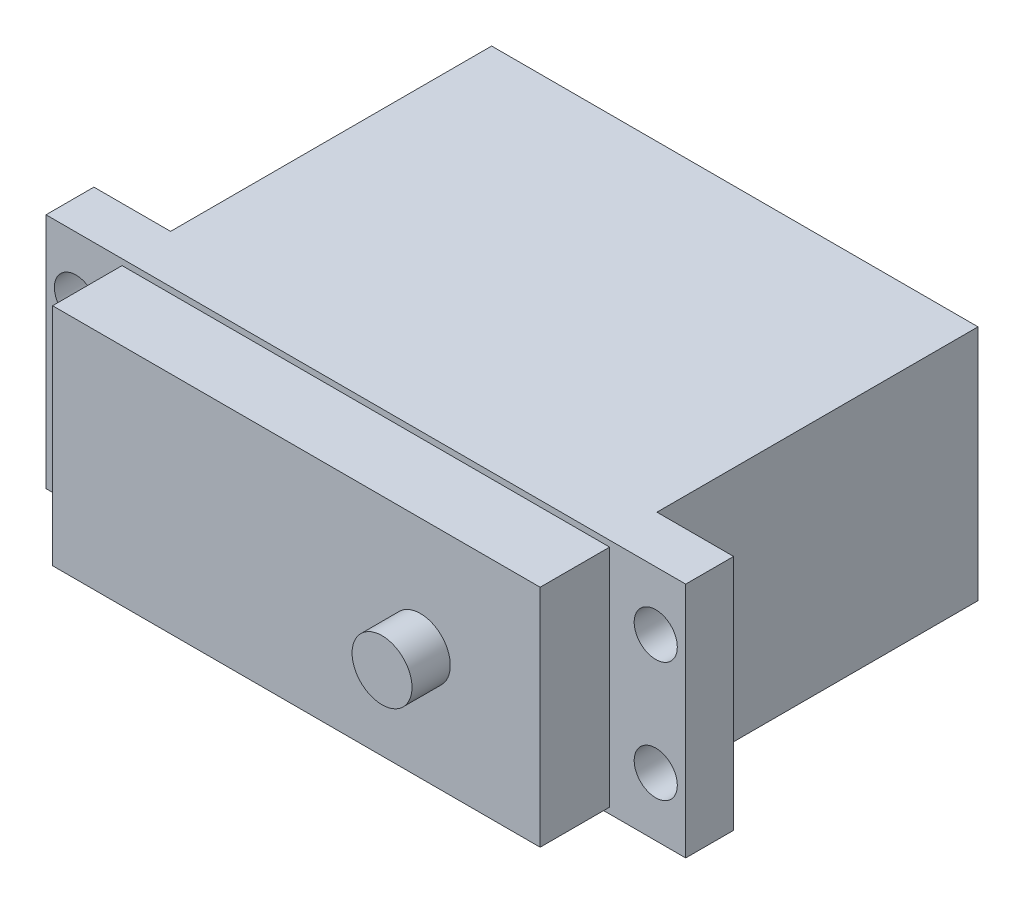
ISO-10303-21;
HEADER;
FILE_DESCRIPTION(('STEP AP214'),'2;1');
FILE_NAME('part.step','',(''),(''),'','','');
FILE_SCHEMA(('AUTOMOTIVE_DESIGN { 1 0 10303 214 1 1 1 1 }'));
ENDSEC;
DATA;
#1=APPLICATION_CONTEXT('core data for automotive mechanical design processes');
#2=APPLICATION_PROTOCOL_DEFINITION('international standard','automotive_design',2000,#1);
#3=PRODUCT_CONTEXT('',#1,'mechanical');
#4=PRODUCT('Part','Part','',(#3));
#5=PRODUCT_RELATED_PRODUCT_CATEGORY('part','',(#4));
#6=PRODUCT_DEFINITION_FORMATION('','',#4);
#7=PRODUCT_DEFINITION_CONTEXT('part definition',#1,'design');
#8=PRODUCT_DEFINITION('design','',#6,#7);
#9=PRODUCT_DEFINITION_SHAPE('','',#8);
#10=(LENGTH_UNIT() NAMED_UNIT(*) SI_UNIT(.MILLI.,.METRE.));
#11=(NAMED_UNIT(*) PLANE_ANGLE_UNIT() SI_UNIT($,.RADIAN.));
#12=(NAMED_UNIT(*) SI_UNIT($,.STERADIAN.) SOLID_ANGLE_UNIT());
#13=UNCERTAINTY_MEASURE_WITH_UNIT(LENGTH_MEASURE(1.E-05),#10,'distance_accuracy_value','');
#14=(GEOMETRIC_REPRESENTATION_CONTEXT(3) GLOBAL_UNCERTAINTY_ASSIGNED_CONTEXT((#13)) GLOBAL_UNIT_ASSIGNED_CONTEXT((#10,
#11,#12)) REPRESENTATION_CONTEXT('',''));
#15=CARTESIAN_POINT('',(0.,0.,0.));
#16=DIRECTION('',(0.,0.,1.));
#17=DIRECTION('',(1.,0.,0.));
#18=AXIS2_PLACEMENT_3D('',#15,#16,#17);
#19=CARTESIAN_POINT('',(0.,0.,30.8));
#20=DIRECTION('',(0.,0.,1.));
#21=DIRECTION('',(1.,0.,0.));
#22=AXIS2_PLACEMENT_3D('',#19,#20,#21);
#23=PLANE('',#22);
#24=CARTESIAN_POINT('',(-3.9,14.9,30.8));
#25=DIRECTION('',(0.,0.,1.));
#26=DIRECTION('',(1.,0.,0.));
#27=AXIS2_PLACEMENT_3D('',#24,#25,#26);
#28=CIRCLE('',#27,1.8);
#29=CARTESIAN_POINT('',(-2.1,14.9,30.8));
#30=VERTEX_POINT('',#29);
#31=EDGE_CURVE('E167',#30,#30,#28,.T.);
#32=ORIENTED_EDGE('',*,*,#31,.F.);
#33=EDGE_LOOP('',(#32));
#34=FACE_BOUND('',#33,.T.);
#35=CARTESIAN_POINT('',(-3.9,4.9,30.8));
#36=DIRECTION('',(0.,0.,1.));
#37=DIRECTION('',(1.,0.,0.));
#38=AXIS2_PLACEMENT_3D('',#35,#36,#37);
#39=CIRCLE('',#38,1.8);
#40=CARTESIAN_POINT('',(-2.1,4.9,30.8));
#41=VERTEX_POINT('',#40);
#42=EDGE_CURVE('E174',#41,#41,#39,.T.);
#43=ORIENTED_EDGE('',*,*,#42,.F.);
#44=EDGE_LOOP('',(#43));
#45=FACE_BOUND('',#44,.T.);
#46=CARTESIAN_POINT('',(44.5,4.9,30.8));
#47=DIRECTION('',(0.,0.,1.));
#48=DIRECTION('',(1.,0.,0.));
#49=AXIS2_PLACEMENT_3D('',#46,#47,#48);
#50=CIRCLE('',#49,1.8);
#51=CARTESIAN_POINT('',(46.3,4.9,30.8));
#52=VERTEX_POINT('',#51);
#53=EDGE_CURVE('E180',#52,#52,#50,.T.);
#54=ORIENTED_EDGE('',*,*,#53,.F.);
#55=EDGE_LOOP('',(#54));
#56=FACE_BOUND('',#55,.T.);
#57=CARTESIAN_POINT('',(44.5,14.9,30.8));
#58=DIRECTION('',(0.,0.,1.));
#59=DIRECTION('',(1.,0.,0.));
#60=AXIS2_PLACEMENT_3D('',#57,#58,#59);
#61=CIRCLE('',#60,1.8);
#62=CARTESIAN_POINT('',(46.3,14.9,30.8));
#63=VERTEX_POINT('',#62);
#64=EDGE_CURVE('E186',#63,#63,#61,.T.);
#65=ORIENTED_EDGE('',*,*,#64,.F.);
#66=EDGE_LOOP('',(#65));
#67=FACE_BOUND('',#66,.T.);
#68=DIRECTION('',(0.,-1.,0.));
#69=VECTOR('',#68,1.);
#70=CARTESIAN_POINT('',(-6.4,0.,30.8));
#71=LINE('',#70,#69);
#72=CARTESIAN_POINT('',(-6.4,19.8,30.8));
#73=VERTEX_POINT('',#72);
#74=CARTESIAN_POINT('',(-6.4,0.,30.8));
#75=VERTEX_POINT('',#74);
#76=EDGE_CURVE('E193',#73,#75,#71,.T.);
#77=ORIENTED_EDGE('',*,*,#76,.T.);
#78=DIRECTION('',(1.,0.,0.));
#79=VECTOR('',#78,1.);
#80=CARTESIAN_POINT('',(47.,0.,30.8));
#81=LINE('',#80,#79);
#82=CARTESIAN_POINT('',(47.,0.,30.8));
#83=VERTEX_POINT('',#82);
#84=EDGE_CURVE('E196',#75,#83,#81,.T.);
#85=ORIENTED_EDGE('',*,*,#84,.T.);
#86=DIRECTION('',(0.,1.,0.));
#87=VECTOR('',#86,1.);
#88=CARTESIAN_POINT('',(47.,0.,30.8));
#89=LINE('',#88,#87);
#90=CARTESIAN_POINT('',(47.,19.8,30.8));
#91=VERTEX_POINT('',#90);
#92=EDGE_CURVE('E199',#83,#91,#89,.T.);
#93=ORIENTED_EDGE('',*,*,#92,.T.);
#94=DIRECTION('',(-1.,0.,0.));
#95=VECTOR('',#94,1.);
#96=CARTESIAN_POINT('',(47.,19.8,30.8));
#97=LINE('',#96,#95);
#98=EDGE_CURVE('E201',#91,#73,#97,.T.);
#99=ORIENTED_EDGE('',*,*,#98,.T.);
#100=EDGE_LOOP('',(#77,#85,#93,#99));
#101=FACE_BOUND('',#100,.T.);
#102=DIRECTION('',(0.,1.,0.));
#103=VECTOR('',#102,1.);
#104=CARTESIAN_POINT('',(40.65,0.49999999999999,30.8));
#105=LINE('',#104,#103);
#106=CARTESIAN_POINT('',(40.65,0.49999999999999,30.8));
#107=VERTEX_POINT('',#106);
#108=CARTESIAN_POINT('',(40.65,19.3,30.8));
#109=VERTEX_POINT('',#108);
#110=EDGE_CURVE('E147',#107,#109,#105,.T.);
#111=ORIENTED_EDGE('',*,*,#110,.F.);
#112=DIRECTION('',(1.,0.,0.));
#113=VECTOR('',#112,1.);
#114=CARTESIAN_POINT('',(-0.0499999999999962,0.49999999999999,30.8));
#115=LINE('',#114,#113);
#116=CARTESIAN_POINT('',(-0.0499999999999962,0.49999999999999,30.8));
#117=VERTEX_POINT('',#116);
#118=EDGE_CURVE('E50',#117,#107,#115,.T.);
#119=ORIENTED_EDGE('',*,*,#118,.F.);
#120=DIRECTION('',(0.,-1.,0.));
#121=VECTOR('',#120,1.);
#122=CARTESIAN_POINT('',(-0.0499999999999962,0.49999999999999,30.8));
#123=LINE('',#122,#121);
#124=CARTESIAN_POINT('',(-0.0499999999999962,19.3,30.8));
#125=VERTEX_POINT('',#124);
#126=EDGE_CURVE('E154',#125,#117,#123,.T.);
#127=ORIENTED_EDGE('',*,*,#126,.F.);
#128=DIRECTION('',(-1.,0.,0.));
#129=VECTOR('',#128,1.);
#130=CARTESIAN_POINT('',(-0.0499999999999962,19.3,30.8));
#131=LINE('',#130,#129);
#132=EDGE_CURVE('E138',#109,#125,#131,.T.);
#133=ORIENTED_EDGE('',*,*,#132,.F.);
#134=EDGE_LOOP('',(#111,#119,#127,#133));
#135=FACE_BOUND('',#134,.T.);
#136=ADVANCED_FACE('F35',(#34,#45,#56,#67,#101,#135),#23,.T.);
#137=CARTESIAN_POINT('',(0.,0.,26.8));
#138=DIRECTION('',(1.,0.,0.));
#139=DIRECTION('',(0.,0.,-1.));
#140=AXIS2_PLACEMENT_3D('',#137,#138,#139);
#141=PLANE('',#140);
#142=DIRECTION('',(0.,-1.,0.));
#143=VECTOR('',#142,1.);
#144=CARTESIAN_POINT('',(0.,0.,0.));
#145=LINE('',#144,#143);
#146=CARTESIAN_POINT('',(0.,19.8,0.));
#147=VERTEX_POINT('',#146);
#148=CARTESIAN_POINT('',(0.,0.,0.));
#149=VERTEX_POINT('',#148);
#150=EDGE_CURVE('E226',#147,#149,#145,.T.);
#151=ORIENTED_EDGE('',*,*,#150,.T.);
#152=DIRECTION('',(0.,0.,-1.));
#153=VECTOR('',#152,1.);
#154=CARTESIAN_POINT('',(0.,0.,26.8));
#155=LINE('',#154,#153);
#156=CARTESIAN_POINT('',(0.,0.,26.8));
#157=VERTEX_POINT('',#156);
#158=EDGE_CURVE('E43',#157,#149,#155,.T.);
#159=ORIENTED_EDGE('',*,*,#158,.F.);
#160=DIRECTION('',(0.,-1.,0.));
#161=VECTOR('',#160,1.);
#162=CARTESIAN_POINT('',(0.,0.,26.8));
#163=LINE('',#162,#161);
#164=CARTESIAN_POINT('',(0.,19.8,26.8));
#165=VERTEX_POINT('',#164);
#166=EDGE_CURVE('E227',#165,#157,#163,.T.);
#167=ORIENTED_EDGE('',*,*,#166,.F.);
#168=DIRECTION('',(0.,0.,-1.));
#169=VECTOR('',#168,1.);
#170=CARTESIAN_POINT('',(0.,19.8,26.8));
#171=LINE('',#170,#169);
#172=EDGE_CURVE('E59',#165,#147,#171,.T.);
#173=ORIENTED_EDGE('',*,*,#172,.T.);
#174=EDGE_LOOP('',(#151,#159,#167,#173));
#175=FACE_BOUND('',#174,.T.);
#176=ADVANCED_FACE('F37',(#175),#141,.F.);
#177=CARTESIAN_POINT('',(0.,0.,26.8));
#178=DIRECTION('',(0.,1.,0.));
#179=DIRECTION('',(0.,0.,1.));
#180=AXIS2_PLACEMENT_3D('',#177,#178,#179);
#181=PLANE('',#180);
#182=DIRECTION('',(1.,0.,0.));
#183=VECTOR('',#182,1.);
#184=CARTESIAN_POINT('',(0.,0.,0.));
#185=LINE('',#184,#183);
#186=CARTESIAN_POINT('',(40.6,0.,0.));
#187=VERTEX_POINT('',#186);
#188=EDGE_CURVE('E233',#149,#187,#185,.T.);
#189=ORIENTED_EDGE('',*,*,#188,.T.);
#190=DIRECTION('',(0.,0.,-1.));
#191=VECTOR('',#190,1.);
#192=CARTESIAN_POINT('',(40.6,0.,26.8));
#193=LINE('',#192,#191);
#194=CARTESIAN_POINT('',(40.6,0.,26.8));
#195=VERTEX_POINT('',#194);
#196=EDGE_CURVE('E241',#195,#187,#193,.T.);
#197=ORIENTED_EDGE('',*,*,#196,.F.);
#198=DIRECTION('',(1.,0.,0.));
#199=VECTOR('',#198,1.);
#200=CARTESIAN_POINT('',(47.,0.,26.8));
#201=LINE('',#200,#199);
#202=CARTESIAN_POINT('',(47.,0.,26.8));
#203=VERTEX_POINT('',#202);
#204=EDGE_CURVE('E206',#195,#203,#201,.T.);
#205=ORIENTED_EDGE('',*,*,#204,.T.);
#206=DIRECTION('',(0.,0.,-1.));
#207=VECTOR('',#206,1.);
#208=CARTESIAN_POINT('',(47.,0.,30.8));
#209=LINE('',#208,#207);
#210=EDGE_CURVE('E220',#83,#203,#209,.T.);
#211=ORIENTED_EDGE('',*,*,#210,.F.);
#212=ORIENTED_EDGE('',*,*,#84,.F.);
#213=DIRECTION('',(0.,0.,-1.));
#214=VECTOR('',#213,1.);
#215=CARTESIAN_POINT('',(-6.4,0.,30.8));
#216=LINE('',#215,#214);
#217=CARTESIAN_POINT('',(-6.4,0.,26.8));
#218=VERTEX_POINT('',#217);
#219=EDGE_CURVE('E223',#75,#218,#216,.T.);
#220=ORIENTED_EDGE('',*,*,#219,.T.);
#221=EDGE_CURVE('E207',#218,#157,#201,.T.);
#222=ORIENTED_EDGE('',*,*,#221,.T.);
#223=ORIENTED_EDGE('',*,*,#158,.T.);
#224=EDGE_LOOP('',(#189,#197,#205,#211,#212,#220,#222,#223));
#225=FACE_BOUND('',#224,.T.);
#226=ADVANCED_FACE('F244',(#225),#181,.F.);
#227=CARTESIAN_POINT('',(40.6,0.,26.8));
#228=DIRECTION('',(-1.,0.,0.));
#229=DIRECTION('',(0.,0.,1.));
#230=AXIS2_PLACEMENT_3D('',#227,#228,#229);
#231=PLANE('',#230);
#232=DIRECTION('',(0.,1.,0.));
#233=VECTOR('',#232,1.);
#234=CARTESIAN_POINT('',(40.6,0.,0.));
#235=LINE('',#234,#233);
#236=CARTESIAN_POINT('',(40.6,19.8,0.));
#237=VERTEX_POINT('',#236);
#238=EDGE_CURVE('E235',#187,#237,#235,.T.);
#239=ORIENTED_EDGE('',*,*,#238,.T.);
#240=DIRECTION('',(0.,0.,-1.));
#241=VECTOR('',#240,1.);
#242=CARTESIAN_POINT('',(40.6,19.8,26.8));
#243=LINE('',#242,#241);
#244=CARTESIAN_POINT('',(40.6,19.8,26.8));
#245=VERTEX_POINT('',#244);
#246=EDGE_CURVE('E239',#245,#237,#243,.T.);
#247=ORIENTED_EDGE('',*,*,#246,.F.);
#248=DIRECTION('',(0.,1.,0.));
#249=VECTOR('',#248,1.);
#250=CARTESIAN_POINT('',(40.6,0.,26.8));
#251=LINE('',#250,#249);
#252=EDGE_CURVE('E229',#195,#245,#251,.T.);
#253=ORIENTED_EDGE('',*,*,#252,.F.);
#254=ORIENTED_EDGE('',*,*,#196,.T.);
#255=EDGE_LOOP('',(#239,#247,#253,#254));
#256=FACE_BOUND('',#255,.T.);
#257=ADVANCED_FACE('F250',(#256),#231,.F.);
#258=CARTESIAN_POINT('',(0.,19.8,26.8));
#259=DIRECTION('',(0.,-1.,0.));
#260=DIRECTION('',(0.,0.,-1.));
#261=AXIS2_PLACEMENT_3D('',#258,#259,#260);
#262=PLANE('',#261);
#263=DIRECTION('',(-1.,0.,0.));
#264=VECTOR('',#263,1.);
#265=CARTESIAN_POINT('',(0.,19.8,0.));
#266=LINE('',#265,#264);
#267=EDGE_CURVE('E78',#237,#147,#266,.T.);
#268=ORIENTED_EDGE('',*,*,#267,.T.);
#269=ORIENTED_EDGE('',*,*,#172,.F.);
#270=DIRECTION('',(-1.,0.,0.));
#271=VECTOR('',#270,1.);
#272=CARTESIAN_POINT('',(47.,19.8,26.8));
#273=LINE('',#272,#271);
#274=CARTESIAN_POINT('',(-6.4,19.8,26.8));
#275=VERTEX_POINT('',#274);
#276=EDGE_CURVE('E212',#165,#275,#273,.T.);
#277=ORIENTED_EDGE('',*,*,#276,.T.);
#278=DIRECTION('',(0.,0.,-1.));
#279=VECTOR('',#278,1.);
#280=CARTESIAN_POINT('',(-6.4,19.8,30.8));
#281=LINE('',#280,#279);
#282=EDGE_CURVE('E203',#73,#275,#281,.T.);
#283=ORIENTED_EDGE('',*,*,#282,.F.);
#284=ORIENTED_EDGE('',*,*,#98,.F.);
#285=DIRECTION('',(0.,0.,-1.));
#286=VECTOR('',#285,1.);
#287=CARTESIAN_POINT('',(47.,19.8,30.8));
#288=LINE('',#287,#286);
#289=CARTESIAN_POINT('',(47.,19.8,26.8));
#290=VERTEX_POINT('',#289);
#291=EDGE_CURVE('E217',#91,#290,#288,.T.);
#292=ORIENTED_EDGE('',*,*,#291,.T.);
#293=EDGE_CURVE('E197',#290,#245,#273,.T.);
#294=ORIENTED_EDGE('',*,*,#293,.T.);
#295=ORIENTED_EDGE('',*,*,#246,.T.);
#296=EDGE_LOOP('',(#268,#269,#277,#283,#284,#292,#294,#295));
#297=FACE_BOUND('',#296,.T.);
#298=ADVANCED_FACE('F252',(#297),#262,.F.);
#299=CARTESIAN_POINT('',(0.,0.,0.));
#300=DIRECTION('',(0.,0.,-1.));
#301=DIRECTION('',(-1.,0.,0.));
#302=AXIS2_PLACEMENT_3D('',#299,#300,#301);
#303=PLANE('',#302);
#304=ORIENTED_EDGE('',*,*,#150,.F.);
#305=ORIENTED_EDGE('',*,*,#267,.F.);
#306=ORIENTED_EDGE('',*,*,#238,.F.);
#307=ORIENTED_EDGE('',*,*,#188,.F.);
#308=EDGE_LOOP('',(#304,#305,#306,#307));
#309=FACE_BOUND('',#308,.T.);
#310=ADVANCED_FACE('F247',(#309),#303,.T.);
#311=CARTESIAN_POINT('',(0.,0.,26.8));
#312=DIRECTION('',(0.,0.,1.));
#313=DIRECTION('',(1.,0.,0.));
#314=AXIS2_PLACEMENT_3D('',#311,#312,#313);
#315=PLANE('',#314);
#316=CARTESIAN_POINT('',(-3.9,14.9,26.8));
#317=DIRECTION('',(0.,0.,1.));
#318=DIRECTION('',(1.,0.,0.));
#319=AXIS2_PLACEMENT_3D('',#316,#317,#318);
#320=CIRCLE('',#319,1.8);
#321=CARTESIAN_POINT('',(-2.10000000000001,14.9,26.8));
#322=VERTEX_POINT('',#321);
#323=EDGE_CURVE('E170',#322,#322,#320,.T.);
#324=ORIENTED_EDGE('',*,*,#323,.T.);
#325=EDGE_LOOP('',(#324));
#326=FACE_BOUND('',#325,.T.);
#327=CARTESIAN_POINT('',(-3.9,4.9,26.8));
#328=DIRECTION('',(0.,0.,1.));
#329=DIRECTION('',(1.,0.,0.));
#330=AXIS2_PLACEMENT_3D('',#327,#328,#329);
#331=CIRCLE('',#330,1.8);
#332=CARTESIAN_POINT('',(-2.10000000000001,4.9,26.8));
#333=VERTEX_POINT('',#332);
#334=EDGE_CURVE('E177',#333,#333,#331,.T.);
#335=ORIENTED_EDGE('',*,*,#334,.T.);
#336=EDGE_LOOP('',(#335));
#337=FACE_BOUND('',#336,.T.);
#338=ORIENTED_EDGE('',*,*,#276,.F.);
#339=ORIENTED_EDGE('',*,*,#166,.T.);
#340=ORIENTED_EDGE('',*,*,#221,.F.);
#341=DIRECTION('',(0.,-1.,0.));
#342=VECTOR('',#341,1.);
#343=CARTESIAN_POINT('',(-6.4,0.,26.8));
#344=LINE('',#343,#342);
#345=EDGE_CURVE('E192',#275,#218,#344,.T.);
#346=ORIENTED_EDGE('',*,*,#345,.F.);
#347=EDGE_LOOP('',(#338,#339,#340,#346));
#348=FACE_BOUND('',#347,.T.);
#349=ADVANCED_FACE('F273',(#326,#337,#348),#315,.F.);
#350=CARTESIAN_POINT('',(44.5,4.9,26.8));
#351=DIRECTION('',(0.,0.,1.));
#352=DIRECTION('',(1.,0.,0.));
#353=AXIS2_PLACEMENT_3D('',#350,#351,#352);
#354=CIRCLE('',#353,1.8);
#355=CARTESIAN_POINT('',(46.3,4.9,26.8));
#356=VERTEX_POINT('',#355);
#357=EDGE_CURVE('E183',#356,#356,#354,.T.);
#358=ORIENTED_EDGE('',*,*,#357,.T.);
#359=EDGE_LOOP('',(#358));
#360=FACE_BOUND('',#359,.T.);
#361=CARTESIAN_POINT('',(44.5,14.9,26.8));
#362=DIRECTION('',(0.,0.,1.));
#363=DIRECTION('',(1.,0.,0.));
#364=AXIS2_PLACEMENT_3D('',#361,#362,#363);
#365=CIRCLE('',#364,1.8);
#366=CARTESIAN_POINT('',(46.3,14.9,26.8));
#367=VERTEX_POINT('',#366);
#368=EDGE_CURVE('E189',#367,#367,#365,.T.);
#369=ORIENTED_EDGE('',*,*,#368,.T.);
#370=EDGE_LOOP('',(#369));
#371=FACE_BOUND('',#370,.T.);
#372=ORIENTED_EDGE('',*,*,#204,.F.);
#373=ORIENTED_EDGE('',*,*,#252,.T.);
#374=ORIENTED_EDGE('',*,*,#293,.F.);
#375=DIRECTION('',(0.,1.,0.));
#376=VECTOR('',#375,1.);
#377=CARTESIAN_POINT('',(47.,0.,26.8));
#378=LINE('',#377,#376);
#379=EDGE_CURVE('E210',#203,#290,#378,.T.);
#380=ORIENTED_EDGE('',*,*,#379,.F.);
#381=EDGE_LOOP('',(#372,#373,#374,#380));
#382=FACE_BOUND('',#381,.T.);
#383=ADVANCED_FACE('F259',(#360,#371,#382),#315,.F.);
#384=CARTESIAN_POINT('',(-6.4,0.,30.8));
#385=DIRECTION('',(1.,0.,0.));
#386=DIRECTION('',(0.,0.,-1.));
#387=AXIS2_PLACEMENT_3D('',#384,#385,#386);
#388=PLANE('',#387);
#389=ORIENTED_EDGE('',*,*,#345,.T.);
#390=ORIENTED_EDGE('',*,*,#219,.F.);
#391=ORIENTED_EDGE('',*,*,#76,.F.);
#392=ORIENTED_EDGE('',*,*,#282,.T.);
#393=EDGE_LOOP('',(#389,#390,#391,#392));
#394=FACE_BOUND('',#393,.T.);
#395=ADVANCED_FACE('F270',(#394),#388,.F.);
#396=CARTESIAN_POINT('',(47.,0.,30.8));
#397=DIRECTION('',(-1.,0.,0.));
#398=DIRECTION('',(0.,0.,1.));
#399=AXIS2_PLACEMENT_3D('',#396,#397,#398);
#400=PLANE('',#399);
#401=ORIENTED_EDGE('',*,*,#379,.T.);
#402=ORIENTED_EDGE('',*,*,#291,.F.);
#403=ORIENTED_EDGE('',*,*,#92,.F.);
#404=ORIENTED_EDGE('',*,*,#210,.T.);
#405=EDGE_LOOP('',(#401,#402,#403,#404));
#406=FACE_BOUND('',#405,.T.);
#407=ADVANCED_FACE('F263',(#406),#400,.F.);
#408=CARTESIAN_POINT('',(44.5,14.9,30.8));
#409=DIRECTION('',(0.,0.,1.));
#410=DIRECTION('',(1.,0.,0.));
#411=AXIS2_PLACEMENT_3D('',#408,#409,#410);
#412=CYLINDRICAL_SURFACE('',#411,1.8);
#413=ORIENTED_EDGE('',*,*,#64,.T.);
#414=EDGE_LOOP('',(#413));
#415=FACE_BOUND('',#414,.T.);
#416=ORIENTED_EDGE('',*,*,#368,.F.);
#417=EDGE_LOOP('',(#416));
#418=FACE_BOUND('',#417,.T.);
#419=ADVANCED_FACE('F294',(#415,#418),#412,.F.);
#420=CARTESIAN_POINT('',(44.5,4.9,30.8));
#421=DIRECTION('',(0.,0.,1.));
#422=DIRECTION('',(1.,0.,0.));
#423=AXIS2_PLACEMENT_3D('',#420,#421,#422);
#424=CYLINDRICAL_SURFACE('',#423,1.8);
#425=ORIENTED_EDGE('',*,*,#53,.T.);
#426=EDGE_LOOP('',(#425));
#427=FACE_BOUND('',#426,.T.);
#428=ORIENTED_EDGE('',*,*,#357,.F.);
#429=EDGE_LOOP('',(#428));
#430=FACE_BOUND('',#429,.T.);
#431=ADVANCED_FACE('F297',(#427,#430),#424,.F.);
#432=CARTESIAN_POINT('',(-3.9,4.9,30.8));
#433=DIRECTION('',(0.,0.,1.));
#434=DIRECTION('',(1.,0.,0.));
#435=AXIS2_PLACEMENT_3D('',#432,#433,#434);
#436=CYLINDRICAL_SURFACE('',#435,1.8);
#437=ORIENTED_EDGE('',*,*,#42,.T.);
#438=EDGE_LOOP('',(#437));
#439=FACE_BOUND('',#438,.T.);
#440=ORIENTED_EDGE('',*,*,#334,.F.);
#441=EDGE_LOOP('',(#440));
#442=FACE_BOUND('',#441,.T.);
#443=ADVANCED_FACE('F301',(#439,#442),#436,.F.);
#444=CARTESIAN_POINT('',(-3.9,14.9,30.8));
#445=DIRECTION('',(0.,0.,1.));
#446=DIRECTION('',(1.,0.,0.));
#447=AXIS2_PLACEMENT_3D('',#444,#445,#446);
#448=CYLINDRICAL_SURFACE('',#447,1.8);
#449=ORIENTED_EDGE('',*,*,#31,.T.);
#450=EDGE_LOOP('',(#449));
#451=FACE_BOUND('',#450,.T.);
#452=ORIENTED_EDGE('',*,*,#323,.F.);
#453=EDGE_LOOP('',(#452));
#454=FACE_BOUND('',#453,.T.);
#455=ADVANCED_FACE('F305',(#451,#454),#448,.F.);
#456=CARTESIAN_POINT('',(-0.0499999999999962,0.49999999999999,118.032242861583));
#457=DIRECTION('',(0.,1.,0.));
#458=DIRECTION('',(0.,0.,1.));
#459=AXIS2_PLACEMENT_3D('',#456,#457,#458);
#460=PLANE('',#459);
#461=DIRECTION('',(0.,0.,-1.));
#462=VECTOR('',#461,1.);
#463=CARTESIAN_POINT('',(40.65,0.49999999999999,118.032242861583));
#464=LINE('',#463,#462);
#465=CARTESIAN_POINT('',(40.65,0.49999999999999,36.6));
#466=VERTEX_POINT('',#465);
#467=EDGE_CURVE('E149',#466,#107,#464,.T.);
#468=ORIENTED_EDGE('',*,*,#467,.F.);
#469=DIRECTION('',(-1.,0.,0.));
#470=VECTOR('',#469,1.);
#471=CARTESIAN_POINT('',(-0.0499999999999962,0.49999999999999,36.6));
#472=LINE('',#471,#470);
#473=CARTESIAN_POINT('',(-0.0499999999999962,0.49999999999999,36.6));
#474=VERTEX_POINT('',#473);
#475=EDGE_CURVE('E143',#466,#474,#472,.T.);
#476=ORIENTED_EDGE('',*,*,#475,.T.);
#477=DIRECTION('',(0.,0.,-1.));
#478=VECTOR('',#477,1.);
#479=CARTESIAN_POINT('',(-0.0499999999999962,0.49999999999999,118.032242861583));
#480=LINE('',#479,#478);
#481=EDGE_CURVE('E161',#474,#117,#480,.T.);
#482=ORIENTED_EDGE('',*,*,#481,.T.);
#483=ORIENTED_EDGE('',*,*,#118,.T.);
#484=EDGE_LOOP('',(#468,#476,#482,#483));
#485=FACE_BOUND('',#484,.T.);
#486=ADVANCED_FACE('F309',(#485),#460,.F.);
#487=CARTESIAN_POINT('',(-0.0499999999999962,0.49999999999999,118.032242861583));
#488=DIRECTION('',(1.,0.,0.));
#489=DIRECTION('',(0.,0.,-1.));
#490=AXIS2_PLACEMENT_3D('',#487,#488,#489);
#491=PLANE('',#490);
#492=ORIENTED_EDGE('',*,*,#481,.F.);
#493=DIRECTION('',(0.,1.,0.));
#494=VECTOR('',#493,1.);
#495=CARTESIAN_POINT('',(-0.0499999999999962,0.49999999999999,36.6));
#496=LINE('',#495,#494);
#497=CARTESIAN_POINT('',(-0.0499999999999962,19.3,36.6));
#498=VERTEX_POINT('',#497);
#499=EDGE_CURVE('E166',#474,#498,#496,.T.);
#500=ORIENTED_EDGE('',*,*,#499,.T.);
#501=DIRECTION('',(0.,0.,-1.));
#502=VECTOR('',#501,1.);
#503=CARTESIAN_POINT('',(-0.0499999999999962,19.3,118.032242861583));
#504=LINE('',#503,#502);
#505=EDGE_CURVE('E144',#498,#125,#504,.T.);
#506=ORIENTED_EDGE('',*,*,#505,.T.);
#507=ORIENTED_EDGE('',*,*,#126,.T.);
#508=EDGE_LOOP('',(#492,#500,#506,#507));
#509=FACE_BOUND('',#508,.T.);
#510=ADVANCED_FACE('F316',(#509),#491,.F.);
#511=CARTESIAN_POINT('',(-0.0499999999999962,19.3,118.032242861583));
#512=DIRECTION('',(0.,-1.,0.));
#513=DIRECTION('',(0.,0.,-1.));
#514=AXIS2_PLACEMENT_3D('',#511,#512,#513);
#515=PLANE('',#514);
#516=ORIENTED_EDGE('',*,*,#505,.F.);
#517=DIRECTION('',(1.,0.,0.));
#518=VECTOR('',#517,1.);
#519=CARTESIAN_POINT('',(-0.0499999999999962,19.3,36.6));
#520=LINE('',#519,#518);
#521=CARTESIAN_POINT('',(40.65,19.3,36.6));
#522=VERTEX_POINT('',#521);
#523=EDGE_CURVE('E140',#498,#522,#520,.T.);
#524=ORIENTED_EDGE('',*,*,#523,.T.);
#525=DIRECTION('',(0.,0.,-1.));
#526=VECTOR('',#525,1.);
#527=CARTESIAN_POINT('',(40.65,19.3,118.032242861583));
#528=LINE('',#527,#526);
#529=EDGE_CURVE('E133',#522,#109,#528,.T.);
#530=ORIENTED_EDGE('',*,*,#529,.T.);
#531=ORIENTED_EDGE('',*,*,#132,.T.);
#532=EDGE_LOOP('',(#516,#524,#530,#531));
#533=FACE_BOUND('',#532,.T.);
#534=ADVANCED_FACE('F136',(#533),#515,.F.);
#535=CARTESIAN_POINT('',(40.65,0.49999999999999,118.032242861583));
#536=DIRECTION('',(-1.,0.,0.));
#537=DIRECTION('',(0.,0.,1.));
#538=AXIS2_PLACEMENT_3D('',#535,#536,#537);
#539=PLANE('',#538);
#540=ORIENTED_EDGE('',*,*,#529,.F.);
#541=DIRECTION('',(0.,-1.,0.));
#542=VECTOR('',#541,1.);
#543=CARTESIAN_POINT('',(40.65,0.49999999999999,36.6));
#544=LINE('',#543,#542);
#545=EDGE_CURVE('E171',#522,#466,#544,.T.);
#546=ORIENTED_EDGE('',*,*,#545,.T.);
#547=ORIENTED_EDGE('',*,*,#467,.T.);
#548=ORIENTED_EDGE('',*,*,#110,.T.);
#549=EDGE_LOOP('',(#540,#546,#547,#548));
#550=FACE_BOUND('',#549,.T.);
#551=ADVANCED_FACE('F148',(#550),#539,.F.);
#552=CARTESIAN_POINT('',(0.,0.,36.6));
#553=DIRECTION('',(0.,0.,-1.));
#554=DIRECTION('',(-1.,0.,0.));
#555=AXIS2_PLACEMENT_3D('',#552,#553,#554);
#556=PLANE('',#555);
#557=CARTESIAN_POINT('',(30.65,9.9,36.6));
#558=DIRECTION('',(0.,0.,-1.));
#559=DIRECTION('',(-1.,0.,0.));
#560=AXIS2_PLACEMENT_3D('',#557,#558,#559);
#561=CIRCLE('',#560,2.5);
#562=CARTESIAN_POINT('',(28.15,9.9,36.6));
#563=VERTEX_POINT('',#562);
#564=EDGE_CURVE('E12',#563,#563,#561,.F.);
#565=ORIENTED_EDGE('',*,*,#564,.F.);
#566=EDGE_LOOP('',(#565));
#567=FACE_BOUND('',#566,.T.);
#568=ORIENTED_EDGE('',*,*,#523,.F.);
#569=ORIENTED_EDGE('',*,*,#499,.F.);
#570=ORIENTED_EDGE('',*,*,#475,.F.);
#571=ORIENTED_EDGE('',*,*,#545,.F.);
#572=EDGE_LOOP('',(#568,#569,#570,#571));
#573=FACE_BOUND('',#572,.T.);
#574=ADVANCED_FACE('F313',(#567,#573),#556,.F.);
#575=CARTESIAN_POINT('',(30.65,9.9,59.8710678118655));
#576=DIRECTION('',(0.,0.,-1.));
#577=DIRECTION('',(-1.,0.,0.));
#578=AXIS2_PLACEMENT_3D('',#575,#576,#577);
#579=CYLINDRICAL_SURFACE('',#578,2.5);
#580=ORIENTED_EDGE('',*,*,#564,.T.);
#581=EDGE_LOOP('',(#580));
#582=FACE_BOUND('',#581,.T.);
#583=CARTESIAN_POINT('',(30.65,9.9,39.8));
#584=DIRECTION('',(0.,0.,1.));
#585=DIRECTION('',(1.,0.,0.));
#586=AXIS2_PLACEMENT_3D('',#583,#584,#585);
#587=CIRCLE('',#586,2.5);
#588=CARTESIAN_POINT('',(33.15,9.9,39.8));
#589=VERTEX_POINT('',#588);
#590=EDGE_CURVE('E151',#589,#589,#587,.T.);
#591=ORIENTED_EDGE('',*,*,#590,.F.);
#592=EDGE_LOOP('',(#591));
#593=FACE_BOUND('',#592,.T.);
#594=ADVANCED_FACE('F324',(#582,#593),#579,.T.);
#595=CARTESIAN_POINT('',(0.,0.,39.8));
#596=DIRECTION('',(0.,0.,1.));
#597=DIRECTION('',(1.,0.,0.));
#598=AXIS2_PLACEMENT_3D('',#595,#596,#597);
#599=PLANE('',#598);
#600=ORIENTED_EDGE('',*,*,#590,.T.);
#601=EDGE_LOOP('',(#600));
#602=FACE_BOUND('',#601,.T.);
#603=ADVANCED_FACE('F326',(#602),#599,.T.);
#604=CLOSED_SHELL('',(#136,#176,#226,#257,#298,#310,#349,#383,#395,#407,#419,#431,#443,#455,
#486,#510,#534,#551,#574,#594,#603));
#605=MANIFOLD_SOLID_BREP('B2',#604);
#606=ADVANCED_BREP_SHAPE_REPRESENTATION('',(#18,#605),#14);
#607=SHAPE_DEFINITION_REPRESENTATION(#9,#606);
ENDSEC;
END-ISO-10303-21;
